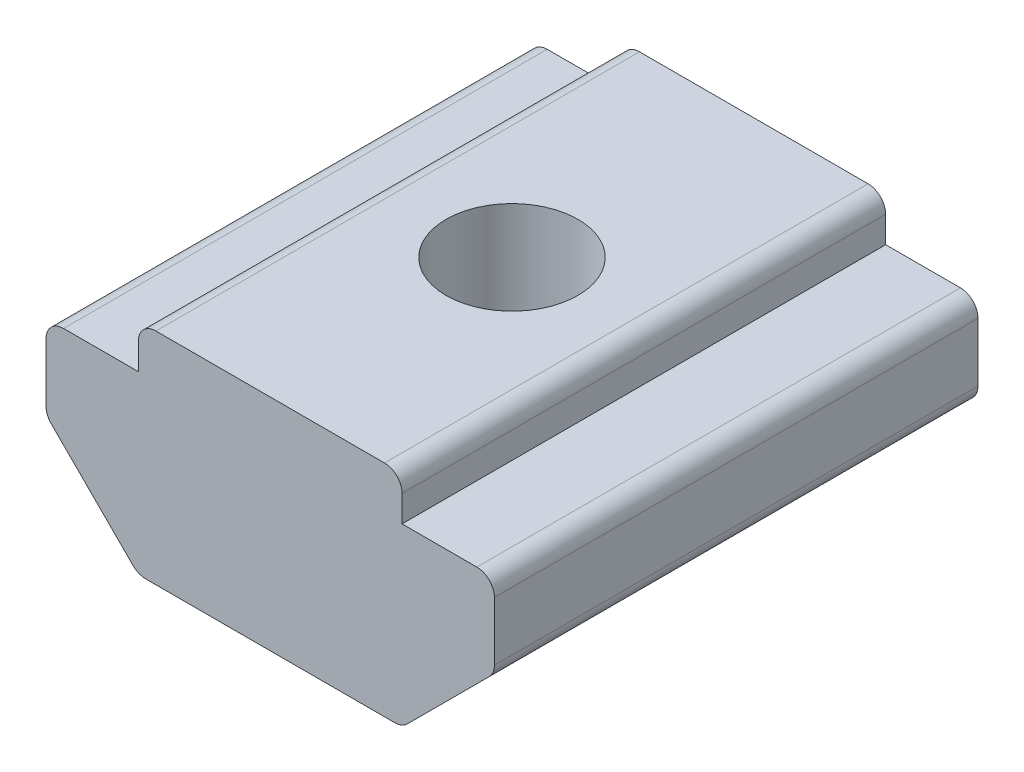
ISO-10303-21;
HEADER;
FILE_DESCRIPTION(('STEP AP214'),'2;1');
FILE_NAME('part.step','',(''),(''),'','','');
FILE_SCHEMA(('AUTOMOTIVE_DESIGN { 1 0 10303 214 1 1 1 1 }'));
ENDSEC;
DATA;
#1=APPLICATION_CONTEXT('core data for automotive mechanical design processes');
#2=APPLICATION_PROTOCOL_DEFINITION('international standard','automotive_design',2000,#1);
#3=PRODUCT_CONTEXT('',#1,'mechanical');
#4=PRODUCT('Part','Part','',(#3));
#5=PRODUCT_RELATED_PRODUCT_CATEGORY('part','',(#4));
#6=PRODUCT_DEFINITION_FORMATION('','',#4);
#7=PRODUCT_DEFINITION_CONTEXT('part definition',#1,'design');
#8=PRODUCT_DEFINITION('design','',#6,#7);
#9=PRODUCT_DEFINITION_SHAPE('','',#8);
#10=(LENGTH_UNIT() NAMED_UNIT(*) SI_UNIT(.MILLI.,.METRE.));
#11=(NAMED_UNIT(*) PLANE_ANGLE_UNIT() SI_UNIT($,.RADIAN.));
#12=(NAMED_UNIT(*) SI_UNIT($,.STERADIAN.) SOLID_ANGLE_UNIT());
#13=UNCERTAINTY_MEASURE_WITH_UNIT(LENGTH_MEASURE(1.E-05),#10,'distance_accuracy_value','');
#14=(GEOMETRIC_REPRESENTATION_CONTEXT(3) GLOBAL_UNCERTAINTY_ASSIGNED_CONTEXT((#13)) GLOBAL_UNIT_ASSIGNED_CONTEXT((#10,
#11,#12)) REPRESENTATION_CONTEXT('',''));
#15=CARTESIAN_POINT('',(0.,0.,0.));
#16=DIRECTION('',(0.,0.,1.));
#17=DIRECTION('',(1.,0.,0.));
#18=AXIS2_PLACEMENT_3D('',#15,#16,#17);
#19=CARTESIAN_POINT('',(-5.1,-1.9,5.5));
#20=DIRECTION('',(1.,0.,0.));
#21=DIRECTION('',(0.,1.,0.));
#22=AXIS2_PLACEMENT_3D('',#19,#20,#21);
#23=PLANE('',#22);
#24=DIRECTION('',(0.,-1.,0.));
#25=VECTOR('',#24,1.);
#26=CARTESIAN_POINT('',(-5.1,-1.9,5.5));
#27=LINE('',#26,#25);
#28=CARTESIAN_POINT('',(-5.1,-0.4,5.5));
#29=VERTEX_POINT('',#28);
#30=CARTESIAN_POINT('',(-5.1,-1.73431457505077,5.5));
#31=VERTEX_POINT('',#30);
#32=EDGE_CURVE('E226',#29,#31,#27,.T.);
#33=ORIENTED_EDGE('',*,*,#32,.F.);
#34=DIRECTION('',(0.,0.,-1.));
#35=VECTOR('',#34,1.);
#36=CARTESIAN_POINT('',(-5.1,-0.4,5.5));
#37=LINE('',#36,#35);
#38=CARTESIAN_POINT('',(-5.1,-0.4,-5.5));
#39=VERTEX_POINT('',#38);
#40=EDGE_CURVE('E269',#29,#39,#37,.T.);
#41=ORIENTED_EDGE('',*,*,#40,.T.);
#42=DIRECTION('',(0.,-1.,0.));
#43=VECTOR('',#42,1.);
#44=CARTESIAN_POINT('',(-5.1,-1.9,-5.5));
#45=LINE('',#44,#43);
#46=CARTESIAN_POINT('',(-5.1,-1.73431457505077,-5.5));
#47=VERTEX_POINT('',#46);
#48=EDGE_CURVE('E200',#39,#47,#45,.T.);
#49=ORIENTED_EDGE('',*,*,#48,.T.);
#50=DIRECTION('',(0.,0.,-1.));
#51=VECTOR('',#50,1.);
#52=CARTESIAN_POINT('',(-5.1,-1.73431457505077,5.5));
#53=LINE('',#52,#51);
#54=EDGE_CURVE('E267',#47,#31,#53,.F.);
#55=ORIENTED_EDGE('',*,*,#54,.T.);
#56=EDGE_LOOP('',(#33,#41,#49,#55));
#57=FACE_BOUND('',#56,.T.);
#58=ADVANCED_FACE('F37',(#57),#23,.F.);
#59=CARTESIAN_POINT('',(-3.,-4.,5.5));
#60=DIRECTION('',(0.707106781186547,0.707106781186548,0.));
#61=DIRECTION('',(-0.707106781186548,0.707106781186547,0.));
#62=AXIS2_PLACEMENT_3D('',#59,#60,#61);
#63=PLANE('',#62);
#64=DIRECTION('',(0.707106781186548,-0.707106781186547,0.));
#65=VECTOR('',#64,1.);
#66=CARTESIAN_POINT('',(-3.,-4.,5.5));
#67=LINE('',#66,#65);
#68=CARTESIAN_POINT('',(-4.98284271247462,-2.01715728752538,5.5));
#69=VERTEX_POINT('',#68);
#70=CARTESIAN_POINT('',(-3.11715728752538,-3.88284271247462,5.5));
#71=VERTEX_POINT('',#70);
#72=EDGE_CURVE('E310',#69,#71,#67,.T.);
#73=ORIENTED_EDGE('',*,*,#72,.F.);
#74=DIRECTION('',(0.,0.,-1.));
#75=VECTOR('',#74,1.);
#76=CARTESIAN_POINT('',(-4.98284271247462,-2.01715728752538,5.5));
#77=LINE('',#76,#75);
#78=CARTESIAN_POINT('',(-4.98284271247462,-2.01715728752538,-5.5));
#79=VERTEX_POINT('',#78);
#80=EDGE_CURVE('E275',#69,#79,#77,.T.);
#81=ORIENTED_EDGE('',*,*,#80,.T.);
#82=DIRECTION('',(0.707106781186548,-0.707106781186547,0.));
#83=VECTOR('',#82,1.);
#84=CARTESIAN_POINT('',(-3.,-4.,-5.5));
#85=LINE('',#84,#83);
#86=CARTESIAN_POINT('',(-3.11715728752538,-3.88284271247462,-5.5));
#87=VERTEX_POINT('',#86);
#88=EDGE_CURVE('E203',#79,#87,#85,.T.);
#89=ORIENTED_EDGE('',*,*,#88,.T.);
#90=DIRECTION('',(0.,0.,-1.));
#91=VECTOR('',#90,1.);
#92=CARTESIAN_POINT('',(-3.11715728752538,-3.88284271247462,5.5));
#93=LINE('',#92,#91);
#94=EDGE_CURVE('E273',#87,#71,#93,.F.);
#95=ORIENTED_EDGE('',*,*,#94,.T.);
#96=EDGE_LOOP('',(#73,#81,#89,#95));
#97=FACE_BOUND('',#96,.T.);
#98=ADVANCED_FACE('F363',(#97),#63,.F.);
#99=CARTESIAN_POINT('',(3.,-4.,5.5));
#100=DIRECTION('',(0.,1.,0.));
#101=DIRECTION('',(0.,0.,1.));
#102=AXIS2_PLACEMENT_3D('',#99,#100,#101);
#103=PLANE('',#102);
#104=CARTESIAN_POINT('',(0.,-4.,0.));
#105=DIRECTION('',(0.,1.,0.));
#106=DIRECTION('',(0.,0.,1.));
#107=AXIS2_PLACEMENT_3D('',#104,#105,#106);
#108=CIRCLE('',#107,1.5);
#109=CARTESIAN_POINT('',(0.,-4.,1.5));
#110=VERTEX_POINT('',#109);
#111=EDGE_CURVE('E204',#110,#110,#108,.T.);
#112=ORIENTED_EDGE('',*,*,#111,.T.);
#113=EDGE_LOOP('',(#112));
#114=FACE_BOUND('',#113,.T.);
#115=DIRECTION('',(1.,0.,0.));
#116=VECTOR('',#115,1.);
#117=CARTESIAN_POINT('',(3.,-4.,5.5));
#118=LINE('',#117,#116);
#119=CARTESIAN_POINT('',(-2.83431457505076,-4.,5.5));
#120=VERTEX_POINT('',#119);
#121=CARTESIAN_POINT('',(2.83431457505076,-4.,5.5));
#122=VERTEX_POINT('',#121);
#123=EDGE_CURVE('E305',#120,#122,#118,.T.);
#124=ORIENTED_EDGE('',*,*,#123,.F.);
#125=DIRECTION('',(0.,0.,-1.));
#126=VECTOR('',#125,1.);
#127=CARTESIAN_POINT('',(-2.83431457505076,-4.,5.5));
#128=LINE('',#127,#126);
#129=CARTESIAN_POINT('',(-2.83431457505076,-4.,-5.5));
#130=VERTEX_POINT('',#129);
#131=EDGE_CURVE('E280',#120,#130,#128,.T.);
#132=ORIENTED_EDGE('',*,*,#131,.T.);
#133=DIRECTION('',(1.,0.,0.));
#134=VECTOR('',#133,1.);
#135=CARTESIAN_POINT('',(3.,-4.,-5.5));
#136=LINE('',#135,#134);
#137=CARTESIAN_POINT('',(2.83431457505076,-4.,-5.5));
#138=VERTEX_POINT('',#137);
#139=EDGE_CURVE('E207',#130,#138,#136,.T.);
#140=ORIENTED_EDGE('',*,*,#139,.T.);
#141=DIRECTION('',(0.,0.,-1.));
#142=VECTOR('',#141,1.);
#143=CARTESIAN_POINT('',(2.83431457505076,-4.,5.5));
#144=LINE('',#143,#142);
#145=EDGE_CURVE('E278',#138,#122,#144,.F.);
#146=ORIENTED_EDGE('',*,*,#145,.T.);
#147=EDGE_LOOP('',(#124,#132,#140,#146));
#148=FACE_BOUND('',#147,.T.);
#149=ADVANCED_FACE('F321',(#114,#148),#103,.F.);
#150=CARTESIAN_POINT('',(5.1,-1.9,5.5));
#151=DIRECTION('',(-0.707106781186547,0.707106781186548,0.));
#152=DIRECTION('',(-0.707106781186548,-0.707106781186547,0.));
#153=AXIS2_PLACEMENT_3D('',#150,#151,#152);
#154=PLANE('',#153);
#155=DIRECTION('',(0.707106781186548,0.707106781186547,0.));
#156=VECTOR('',#155,1.);
#157=CARTESIAN_POINT('',(5.1,-1.9,5.5));
#158=LINE('',#157,#156);
#159=CARTESIAN_POINT('',(3.11715728752538,-3.88284271247462,5.5));
#160=VERTEX_POINT('',#159);
#161=CARTESIAN_POINT('',(4.98284271247462,-2.01715728752538,5.5));
#162=VERTEX_POINT('',#161);
#163=EDGE_CURVE('E304',#160,#162,#158,.T.);
#164=ORIENTED_EDGE('',*,*,#163,.F.);
#165=DIRECTION('',(0.,0.,-1.));
#166=VECTOR('',#165,1.);
#167=CARTESIAN_POINT('',(3.11715728752538,-3.88284271247462,5.5));
#168=LINE('',#167,#166);
#169=CARTESIAN_POINT('',(3.11715728752538,-3.88284271247462,-5.5));
#170=VERTEX_POINT('',#169);
#171=EDGE_CURVE('E285',#160,#170,#168,.T.);
#172=ORIENTED_EDGE('',*,*,#171,.T.);
#173=DIRECTION('',(0.707106781186548,0.707106781186547,0.));
#174=VECTOR('',#173,1.);
#175=CARTESIAN_POINT('',(5.1,-1.9,-5.5));
#176=LINE('',#175,#174);
#177=CARTESIAN_POINT('',(4.98284271247462,-2.01715728752538,-5.5));
#178=VERTEX_POINT('',#177);
#179=EDGE_CURVE('E210',#170,#178,#176,.T.);
#180=ORIENTED_EDGE('',*,*,#179,.T.);
#181=DIRECTION('',(0.,0.,-1.));
#182=VECTOR('',#181,1.);
#183=CARTESIAN_POINT('',(4.98284271247462,-2.01715728752538,5.5));
#184=LINE('',#183,#182);
#185=EDGE_CURVE('E283',#178,#162,#184,.F.);
#186=ORIENTED_EDGE('',*,*,#185,.T.);
#187=EDGE_LOOP('',(#164,#172,#180,#186));
#188=FACE_BOUND('',#187,.T.);
#189=ADVANCED_FACE('F378',(#188),#154,.F.);
#190=CARTESIAN_POINT('',(5.1,0.,5.5));
#191=DIRECTION('',(-1.,0.,0.));
#192=DIRECTION('',(0.,-1.,0.));
#193=AXIS2_PLACEMENT_3D('',#190,#191,#192);
#194=PLANE('',#193);
#195=DIRECTION('',(0.,1.,0.));
#196=VECTOR('',#195,1.);
#197=CARTESIAN_POINT('',(5.1,0.,5.5));
#198=LINE('',#197,#196);
#199=CARTESIAN_POINT('',(5.1,-1.73431457505076,5.5));
#200=VERTEX_POINT('',#199);
#201=CARTESIAN_POINT('',(5.1,-0.4,5.5));
#202=VERTEX_POINT('',#201);
#203=EDGE_CURVE('E175',#200,#202,#198,.T.);
#204=ORIENTED_EDGE('',*,*,#203,.F.);
#205=DIRECTION('',(0.,0.,-1.));
#206=VECTOR('',#205,1.);
#207=CARTESIAN_POINT('',(5.1,-1.73431457505076,5.5));
#208=LINE('',#207,#206);
#209=CARTESIAN_POINT('',(5.1,-1.73431457505076,-5.5));
#210=VERTEX_POINT('',#209);
#211=EDGE_CURVE('E45',#200,#210,#208,.T.);
#212=ORIENTED_EDGE('',*,*,#211,.T.);
#213=DIRECTION('',(0.,1.,0.));
#214=VECTOR('',#213,1.);
#215=CARTESIAN_POINT('',(5.1,0.,-5.5));
#216=LINE('',#215,#214);
#217=CARTESIAN_POINT('',(5.1,-0.4,-5.5));
#218=VERTEX_POINT('',#217);
#219=EDGE_CURVE('E213',#210,#218,#216,.T.);
#220=ORIENTED_EDGE('',*,*,#219,.T.);
#221=DIRECTION('',(0.,0.,-1.));
#222=VECTOR('',#221,1.);
#223=CARTESIAN_POINT('',(5.1,-0.4,5.5));
#224=LINE('',#223,#222);
#225=EDGE_CURVE('E288',#218,#202,#224,.F.);
#226=ORIENTED_EDGE('',*,*,#225,.T.);
#227=EDGE_LOOP('',(#204,#212,#220,#226));
#228=FACE_BOUND('',#227,.T.);
#229=ADVANCED_FACE('F294',(#228),#194,.F.);
#230=CARTESIAN_POINT('',(3.,0.,5.5));
#231=DIRECTION('',(0.,-1.,0.));
#232=DIRECTION('',(0.,0.,-1.));
#233=AXIS2_PLACEMENT_3D('',#230,#231,#232);
#234=PLANE('',#233);
#235=DIRECTION('',(-1.,0.,0.));
#236=VECTOR('',#235,1.);
#237=CARTESIAN_POINT('',(3.,0.,5.5));
#238=LINE('',#237,#236);
#239=CARTESIAN_POINT('',(4.7,0.,5.5));
#240=VERTEX_POINT('',#239);
#241=CARTESIAN_POINT('',(3.,0.,5.5));
#242=VERTEX_POINT('',#241);
#243=EDGE_CURVE('E164',#240,#242,#238,.T.);
#244=ORIENTED_EDGE('',*,*,#243,.F.);
#245=DIRECTION('',(0.,0.,-1.));
#246=VECTOR('',#245,1.);
#247=CARTESIAN_POINT('',(4.7,0.,5.5));
#248=LINE('',#247,#246);
#249=CARTESIAN_POINT('',(4.7,0.,-5.5));
#250=VERTEX_POINT('',#249);
#251=EDGE_CURVE('E11',#240,#250,#248,.T.);
#252=ORIENTED_EDGE('',*,*,#251,.T.);
#253=DIRECTION('',(-1.,0.,0.));
#254=VECTOR('',#253,1.);
#255=CARTESIAN_POINT('',(3.,0.,-5.5));
#256=LINE('',#255,#254);
#257=CARTESIAN_POINT('',(3.,0.,-5.5));
#258=VERTEX_POINT('',#257);
#259=EDGE_CURVE('E181',#250,#258,#256,.T.);
#260=ORIENTED_EDGE('',*,*,#259,.T.);
#261=DIRECTION('',(0.,0.,-1.));
#262=VECTOR('',#261,1.);
#263=CARTESIAN_POINT('',(3.,0.,5.5));
#264=LINE('',#263,#262);
#265=EDGE_CURVE('E178',#242,#258,#264,.T.);
#266=ORIENTED_EDGE('',*,*,#265,.F.);
#267=EDGE_LOOP('',(#244,#252,#260,#266));
#268=FACE_BOUND('',#267,.T.);
#269=ADVANCED_FACE('F179',(#268),#234,.F.);
#270=CARTESIAN_POINT('',(3.,0.999999999999999,5.5));
#271=DIRECTION('',(-1.,0.,0.));
#272=DIRECTION('',(0.,0.,1.));
#273=AXIS2_PLACEMENT_3D('',#270,#271,#272);
#274=PLANE('',#273);
#275=DIRECTION('',(0.,1.,0.));
#276=VECTOR('',#275,1.);
#277=CARTESIAN_POINT('',(3.,0.999999999999999,-5.5));
#278=LINE('',#277,#276);
#279=CARTESIAN_POINT('',(3.,0.599999999999999,-5.5));
#280=VERTEX_POINT('',#279);
#281=EDGE_CURVE('E217',#258,#280,#278,.T.);
#282=ORIENTED_EDGE('',*,*,#281,.T.);
#283=DIRECTION('',(0.,0.,-1.));
#284=VECTOR('',#283,1.);
#285=CARTESIAN_POINT('',(3.,0.599999999999999,5.5));
#286=LINE('',#285,#284);
#287=CARTESIAN_POINT('',(3.,0.599999999999999,5.5));
#288=VERTEX_POINT('',#287);
#289=EDGE_CURVE('E190',#280,#288,#286,.F.);
#290=ORIENTED_EDGE('',*,*,#289,.T.);
#291=DIRECTION('',(0.,1.,0.));
#292=VECTOR('',#291,1.);
#293=CARTESIAN_POINT('',(3.,0.999999999999999,5.5));
#294=LINE('',#293,#292);
#295=EDGE_CURVE('E168',#242,#288,#294,.T.);
#296=ORIENTED_EDGE('',*,*,#295,.F.);
#297=ORIENTED_EDGE('',*,*,#265,.T.);
#298=EDGE_LOOP('',(#282,#290,#296,#297));
#299=FACE_BOUND('',#298,.T.);
#300=ADVANCED_FACE('F188',(#299),#274,.F.);
#301=CARTESIAN_POINT('',(-3.,0.999999999999999,5.5));
#302=DIRECTION('',(0.,-1.,0.));
#303=DIRECTION('',(0.,0.,-1.));
#304=AXIS2_PLACEMENT_3D('',#301,#302,#303);
#305=PLANE('',#304);
#306=CARTESIAN_POINT('',(0.,0.999999999999999,0.));
#307=DIRECTION('',(0.,1.,0.));
#308=DIRECTION('',(0.,0.,1.));
#309=AXIS2_PLACEMENT_3D('',#306,#307,#308);
#310=CIRCLE('',#309,1.5);
#311=CARTESIAN_POINT('',(0.,0.999999999999999,1.5));
#312=VERTEX_POINT('',#311);
#313=EDGE_CURVE('E315',#312,#312,#310,.T.);
#314=ORIENTED_EDGE('',*,*,#313,.F.);
#315=EDGE_LOOP('',(#314));
#316=FACE_BOUND('',#315,.T.);
#317=DIRECTION('',(-1.,0.,0.));
#318=VECTOR('',#317,1.);
#319=CARTESIAN_POINT('',(-3.,0.999999999999999,5.5));
#320=LINE('',#319,#318);
#321=CARTESIAN_POINT('',(2.6,0.999999999999999,5.5));
#322=VERTEX_POINT('',#321);
#323=CARTESIAN_POINT('',(-2.6,0.999999999999999,5.5));
#324=VERTEX_POINT('',#323);
#325=EDGE_CURVE('E191',#322,#324,#320,.T.);
#326=ORIENTED_EDGE('',*,*,#325,.F.);
#327=DIRECTION('',(0.,0.,-1.));
#328=VECTOR('',#327,1.);
#329=CARTESIAN_POINT('',(2.6,0.999999999999999,5.5));
#330=LINE('',#329,#328);
#331=CARTESIAN_POINT('',(2.6,0.999999999999999,-5.5));
#332=VERTEX_POINT('',#331);
#333=EDGE_CURVE('E230',#322,#332,#330,.T.);
#334=ORIENTED_EDGE('',*,*,#333,.T.);
#335=DIRECTION('',(-1.,0.,0.));
#336=VECTOR('',#335,1.);
#337=CARTESIAN_POINT('',(-3.,0.999999999999999,-5.5));
#338=LINE('',#337,#336);
#339=CARTESIAN_POINT('',(-2.6,0.999999999999999,-5.5));
#340=VERTEX_POINT('',#339);
#341=EDGE_CURVE('E219',#332,#340,#338,.T.);
#342=ORIENTED_EDGE('',*,*,#341,.T.);
#343=DIRECTION('',(0.,0.,-1.));
#344=VECTOR('',#343,1.);
#345=CARTESIAN_POINT('',(-2.6,0.999999999999999,5.5));
#346=LINE('',#345,#344);
#347=EDGE_CURVE('E185',#340,#324,#346,.F.);
#348=ORIENTED_EDGE('',*,*,#347,.T.);
#349=EDGE_LOOP('',(#326,#334,#342,#348));
#350=FACE_BOUND('',#349,.T.);
#351=ADVANCED_FACE('F331',(#316,#350),#305,.F.);
#352=CARTESIAN_POINT('',(-3.,0.,5.5));
#353=DIRECTION('',(1.,0.,0.));
#354=DIRECTION('',(0.,0.,-1.));
#355=AXIS2_PLACEMENT_3D('',#352,#353,#354);
#356=PLANE('',#355);
#357=DIRECTION('',(0.,-1.,0.));
#358=VECTOR('',#357,1.);
#359=CARTESIAN_POINT('',(-3.,0.,5.5));
#360=LINE('',#359,#358);
#361=CARTESIAN_POINT('',(-3.,0.599999999999999,5.5));
#362=VERTEX_POINT('',#361);
#363=CARTESIAN_POINT('',(-3.,0.,5.5));
#364=VERTEX_POINT('',#363);
#365=EDGE_CURVE('E193',#362,#364,#360,.T.);
#366=ORIENTED_EDGE('',*,*,#365,.F.);
#367=DIRECTION('',(0.,0.,-1.));
#368=VECTOR('',#367,1.);
#369=CARTESIAN_POINT('',(-3.,0.599999999999999,5.5));
#370=LINE('',#369,#368);
#371=CARTESIAN_POINT('',(-3.,0.599999999999999,-5.5));
#372=VERTEX_POINT('',#371);
#373=EDGE_CURVE('E264',#362,#372,#370,.T.);
#374=ORIENTED_EDGE('',*,*,#373,.T.);
#375=DIRECTION('',(0.,-1.,0.));
#376=VECTOR('',#375,1.);
#377=CARTESIAN_POINT('',(-3.,0.,-5.5));
#378=LINE('',#377,#376);
#379=CARTESIAN_POINT('',(-3.,0.,-5.5));
#380=VERTEX_POINT('',#379);
#381=EDGE_CURVE('E222',#372,#380,#378,.T.);
#382=ORIENTED_EDGE('',*,*,#381,.T.);
#383=DIRECTION('',(0.,0.,-1.));
#384=VECTOR('',#383,1.);
#385=CARTESIAN_POINT('',(-3.,0.,5.5));
#386=LINE('',#385,#384);
#387=EDGE_CURVE('E186',#364,#380,#386,.T.);
#388=ORIENTED_EDGE('',*,*,#387,.F.);
#389=EDGE_LOOP('',(#366,#374,#382,#388));
#390=FACE_BOUND('',#389,.T.);
#391=ADVANCED_FACE('F334',(#390),#356,.F.);
#392=CARTESIAN_POINT('',(-5.1,0.,5.5));
#393=DIRECTION('',(0.,-1.,0.));
#394=DIRECTION('',(0.,0.,-1.));
#395=AXIS2_PLACEMENT_3D('',#392,#393,#394);
#396=PLANE('',#395);
#397=DIRECTION('',(-1.,0.,0.));
#398=VECTOR('',#397,1.);
#399=CARTESIAN_POINT('',(-5.1,0.,-5.5));
#400=LINE('',#399,#398);
#401=CARTESIAN_POINT('',(-4.7,0.,-5.5));
#402=VERTEX_POINT('',#401);
#403=EDGE_CURVE('E224',#380,#402,#400,.T.);
#404=ORIENTED_EDGE('',*,*,#403,.T.);
#405=DIRECTION('',(0.,0.,-1.));
#406=VECTOR('',#405,1.);
#407=CARTESIAN_POINT('',(-4.7,0.,5.5));
#408=LINE('',#407,#406);
#409=CARTESIAN_POINT('',(-4.7,0.,5.5));
#410=VERTEX_POINT('',#409);
#411=EDGE_CURVE('E52',#402,#410,#408,.F.);
#412=ORIENTED_EDGE('',*,*,#411,.T.);
#413=DIRECTION('',(-1.,0.,0.));
#414=VECTOR('',#413,1.);
#415=CARTESIAN_POINT('',(-5.1,0.,5.5));
#416=LINE('',#415,#414);
#417=EDGE_CURVE('E198',#364,#410,#416,.T.);
#418=ORIENTED_EDGE('',*,*,#417,.F.);
#419=ORIENTED_EDGE('',*,*,#387,.T.);
#420=EDGE_LOOP('',(#404,#412,#418,#419));
#421=FACE_BOUND('',#420,.T.);
#422=ADVANCED_FACE('F348',(#421),#396,.F.);
#423=CARTESIAN_POINT('',(0.,0.,5.5));
#424=DIRECTION('',(0.,0.,-1.));
#425=DIRECTION('',(-1.,0.,0.));
#426=AXIS2_PLACEMENT_3D('',#423,#424,#425);
#427=PLANE('',#426);
#428=ORIENTED_EDGE('',*,*,#295,.T.);
#429=CARTESIAN_POINT('',(2.6,0.599999999999999,5.5));
#430=DIRECTION('',(0.,0.,-1.));
#431=DIRECTION('',(-1.,0.,0.));
#432=AXIS2_PLACEMENT_3D('',#429,#430,#431);
#433=CIRCLE('',#432,0.4);
#434=EDGE_CURVE('E262',#288,#322,#433,.F.);
#435=ORIENTED_EDGE('',*,*,#434,.T.);
#436=ORIENTED_EDGE('',*,*,#325,.T.);
#437=CARTESIAN_POINT('',(-2.6,0.599999999999999,5.5));
#438=DIRECTION('',(0.,0.,-1.));
#439=DIRECTION('',(-1.,0.,0.));
#440=AXIS2_PLACEMENT_3D('',#437,#438,#439);
#441=CIRCLE('',#440,0.4);
#442=EDGE_CURVE('E60',#324,#362,#441,.F.);
#443=ORIENTED_EDGE('',*,*,#442,.T.);
#444=ORIENTED_EDGE('',*,*,#365,.T.);
#445=ORIENTED_EDGE('',*,*,#417,.T.);
#446=CARTESIAN_POINT('',(-4.7,-0.4,5.5));
#447=DIRECTION('',(0.,0.,-1.));
#448=DIRECTION('',(-1.,0.,0.));
#449=AXIS2_PLACEMENT_3D('',#446,#447,#448);
#450=CIRCLE('',#449,0.4);
#451=EDGE_CURVE('E259',#410,#29,#450,.F.);
#452=ORIENTED_EDGE('',*,*,#451,.T.);
#453=ORIENTED_EDGE('',*,*,#32,.T.);
#454=CARTESIAN_POINT('',(-4.7,-1.73431457505077,5.5));
#455=DIRECTION('',(0.,0.,-1.));
#456=DIRECTION('',(-1.,0.,0.));
#457=AXIS2_PLACEMENT_3D('',#454,#455,#456);
#458=CIRCLE('',#457,0.4);
#459=EDGE_CURVE('E257',#31,#69,#458,.F.);
#460=ORIENTED_EDGE('',*,*,#459,.T.);
#461=ORIENTED_EDGE('',*,*,#72,.T.);
#462=CARTESIAN_POINT('',(-2.83431457505076,-3.6,5.5));
#463=DIRECTION('',(0.,0.,-1.));
#464=DIRECTION('',(-1.,0.,0.));
#465=AXIS2_PLACEMENT_3D('',#462,#463,#464);
#466=CIRCLE('',#465,0.4);
#467=EDGE_CURVE('E255',#71,#120,#466,.F.);
#468=ORIENTED_EDGE('',*,*,#467,.T.);
#469=ORIENTED_EDGE('',*,*,#123,.T.);
#470=CARTESIAN_POINT('',(2.83431457505076,-3.6,5.5));
#471=DIRECTION('',(0.,0.,-1.));
#472=DIRECTION('',(-1.,0.,0.));
#473=AXIS2_PLACEMENT_3D('',#470,#471,#472);
#474=CIRCLE('',#473,0.4);
#475=EDGE_CURVE('E253',#122,#160,#474,.F.);
#476=ORIENTED_EDGE('',*,*,#475,.T.);
#477=ORIENTED_EDGE('',*,*,#163,.T.);
#478=CARTESIAN_POINT('',(4.7,-1.73431457505076,5.5));
#479=DIRECTION('',(0.,0.,-1.));
#480=DIRECTION('',(-1.,0.,0.));
#481=AXIS2_PLACEMENT_3D('',#478,#479,#480);
#482=CIRCLE('',#481,0.4);
#483=EDGE_CURVE('E251',#162,#200,#482,.F.);
#484=ORIENTED_EDGE('',*,*,#483,.T.);
#485=ORIENTED_EDGE('',*,*,#203,.T.);
#486=CARTESIAN_POINT('',(4.7,-0.4,5.5));
#487=DIRECTION('',(0.,0.,-1.));
#488=DIRECTION('',(-1.,0.,0.));
#489=AXIS2_PLACEMENT_3D('',#486,#487,#488);
#490=CIRCLE('',#489,0.4);
#491=EDGE_CURVE('E172',#202,#240,#490,.F.);
#492=ORIENTED_EDGE('',*,*,#491,.T.);
#493=ORIENTED_EDGE('',*,*,#243,.T.);
#494=EDGE_LOOP('',(#428,#435,#436,#443,#444,#445,#452,#453,#460,#461,#468,#469,#476,#477,#484,
#485,#492,#493));
#495=FACE_BOUND('',#494,.T.);
#496=ADVANCED_FACE('F166',(#495),#427,.F.);
#497=CARTESIAN_POINT('',(0.,0.,-5.5));
#498=DIRECTION('',(0.,0.,-1.));
#499=DIRECTION('',(-1.,0.,0.));
#500=AXIS2_PLACEMENT_3D('',#497,#498,#499);
#501=PLANE('',#500);
#502=ORIENTED_EDGE('',*,*,#341,.F.);
#503=CARTESIAN_POINT('',(2.6,0.599999999999999,-5.5));
#504=DIRECTION('',(0.,0.,-1.));
#505=DIRECTION('',(-1.,0.,0.));
#506=AXIS2_PLACEMENT_3D('',#503,#504,#505);
#507=CIRCLE('',#506,0.4);
#508=EDGE_CURVE('E247',#332,#280,#507,.T.);
#509=ORIENTED_EDGE('',*,*,#508,.T.);
#510=ORIENTED_EDGE('',*,*,#281,.F.);
#511=ORIENTED_EDGE('',*,*,#259,.F.);
#512=CARTESIAN_POINT('',(4.7,-0.4,-5.5));
#513=DIRECTION('',(0.,0.,-1.));
#514=DIRECTION('',(-1.,0.,0.));
#515=AXIS2_PLACEMENT_3D('',#512,#513,#514);
#516=CIRCLE('',#515,0.4);
#517=EDGE_CURVE('E233',#250,#218,#516,.T.);
#518=ORIENTED_EDGE('',*,*,#517,.T.);
#519=ORIENTED_EDGE('',*,*,#219,.F.);
#520=CARTESIAN_POINT('',(4.7,-1.73431457505076,-5.5));
#521=DIRECTION('',(0.,0.,-1.));
#522=DIRECTION('',(-1.,0.,0.));
#523=AXIS2_PLACEMENT_3D('',#520,#521,#522);
#524=CIRCLE('',#523,0.4);
#525=EDGE_CURVE('E235',#210,#178,#524,.T.);
#526=ORIENTED_EDGE('',*,*,#525,.T.);
#527=ORIENTED_EDGE('',*,*,#179,.F.);
#528=CARTESIAN_POINT('',(2.83431457505076,-3.6,-5.5));
#529=DIRECTION('',(0.,0.,-1.));
#530=DIRECTION('',(-1.,0.,0.));
#531=AXIS2_PLACEMENT_3D('',#528,#529,#530);
#532=CIRCLE('',#531,0.4);
#533=EDGE_CURVE('E237',#170,#138,#532,.T.);
#534=ORIENTED_EDGE('',*,*,#533,.T.);
#535=ORIENTED_EDGE('',*,*,#139,.F.);
#536=CARTESIAN_POINT('',(-2.83431457505076,-3.6,-5.5));
#537=DIRECTION('',(0.,0.,-1.));
#538=DIRECTION('',(-1.,0.,0.));
#539=AXIS2_PLACEMENT_3D('',#536,#537,#538);
#540=CIRCLE('',#539,0.4);
#541=EDGE_CURVE('E239',#130,#87,#540,.T.);
#542=ORIENTED_EDGE('',*,*,#541,.T.);
#543=ORIENTED_EDGE('',*,*,#88,.F.);
#544=CARTESIAN_POINT('',(-4.7,-1.73431457505077,-5.5));
#545=DIRECTION('',(0.,0.,-1.));
#546=DIRECTION('',(-1.,0.,0.));
#547=AXIS2_PLACEMENT_3D('',#544,#545,#546);
#548=CIRCLE('',#547,0.4);
#549=EDGE_CURVE('E241',#79,#47,#548,.T.);
#550=ORIENTED_EDGE('',*,*,#549,.T.);
#551=ORIENTED_EDGE('',*,*,#48,.F.);
#552=CARTESIAN_POINT('',(-4.7,-0.4,-5.5));
#553=DIRECTION('',(0.,0.,-1.));
#554=DIRECTION('',(-1.,0.,0.));
#555=AXIS2_PLACEMENT_3D('',#552,#553,#554);
#556=CIRCLE('',#555,0.4);
#557=EDGE_CURVE('E243',#39,#402,#556,.T.);
#558=ORIENTED_EDGE('',*,*,#557,.T.);
#559=ORIENTED_EDGE('',*,*,#403,.F.);
#560=ORIENTED_EDGE('',*,*,#381,.F.);
#561=CARTESIAN_POINT('',(-2.6,0.599999999999999,-5.5));
#562=DIRECTION('',(0.,0.,-1.));
#563=DIRECTION('',(-1.,0.,0.));
#564=AXIS2_PLACEMENT_3D('',#561,#562,#563);
#565=CIRCLE('',#564,0.4);
#566=EDGE_CURVE('E245',#372,#340,#565,.T.);
#567=ORIENTED_EDGE('',*,*,#566,.T.);
#568=EDGE_LOOP('',(#502,#509,#510,#511,#518,#519,#526,#527,#534,#535,#542,#543,#550,#551,#558,
#559,#560,#567));
#569=FACE_BOUND('',#568,.T.);
#570=ADVANCED_FACE('F300',(#569),#501,.T.);
#571=CARTESIAN_POINT('',(0.,-4.,0.));
#572=DIRECTION('',(0.,1.,0.));
#573=DIRECTION('',(0.,0.,1.));
#574=AXIS2_PLACEMENT_3D('',#571,#572,#573);
#575=CYLINDRICAL_SURFACE('',#574,1.5);
#576=ORIENTED_EDGE('',*,*,#111,.F.);
#577=EDGE_LOOP('',(#576));
#578=FACE_BOUND('',#577,.T.);
#579=ORIENTED_EDGE('',*,*,#313,.T.);
#580=EDGE_LOOP('',(#579));
#581=FACE_BOUND('',#580,.T.);
#582=ADVANCED_FACE('F324',(#578,#581),#575,.F.);
#583=CARTESIAN_POINT('',(2.6,0.599999999999999,5.5));
#584=DIRECTION('',(0.,0.,-1.));
#585=DIRECTION('',(-1.,0.,0.));
#586=AXIS2_PLACEMENT_3D('',#583,#584,#585);
#587=CYLINDRICAL_SURFACE('',#586,0.4);
#588=ORIENTED_EDGE('',*,*,#434,.F.);
#589=ORIENTED_EDGE('',*,*,#289,.F.);
#590=ORIENTED_EDGE('',*,*,#508,.F.);
#591=ORIENTED_EDGE('',*,*,#333,.F.);
#592=EDGE_LOOP('',(#588,#589,#590,#591));
#593=FACE_BOUND('',#592,.T.);
#594=ADVANCED_FACE('F327',(#593),#587,.T.);
#595=CARTESIAN_POINT('',(-2.6,0.599999999999999,5.5));
#596=DIRECTION('',(0.,0.,-1.));
#597=DIRECTION('',(-1.,0.,0.));
#598=AXIS2_PLACEMENT_3D('',#595,#596,#597);
#599=CYLINDRICAL_SURFACE('',#598,0.4);
#600=ORIENTED_EDGE('',*,*,#442,.F.);
#601=ORIENTED_EDGE('',*,*,#347,.F.);
#602=ORIENTED_EDGE('',*,*,#566,.F.);
#603=ORIENTED_EDGE('',*,*,#373,.F.);
#604=EDGE_LOOP('',(#600,#601,#602,#603));
#605=FACE_BOUND('',#604,.T.);
#606=ADVANCED_FACE('F342',(#605),#599,.T.);
#607=CARTESIAN_POINT('',(-4.7,-0.4,5.5));
#608=DIRECTION('',(0.,0.,-1.));
#609=DIRECTION('',(-1.,0.,0.));
#610=AXIS2_PLACEMENT_3D('',#607,#608,#609);
#611=CYLINDRICAL_SURFACE('',#610,0.4);
#612=ORIENTED_EDGE('',*,*,#451,.F.);
#613=ORIENTED_EDGE('',*,*,#411,.F.);
#614=ORIENTED_EDGE('',*,*,#557,.F.);
#615=ORIENTED_EDGE('',*,*,#40,.F.);
#616=EDGE_LOOP('',(#612,#613,#614,#615));
#617=FACE_BOUND('',#616,.T.);
#618=ADVANCED_FACE('F351',(#617),#611,.T.);
#619=CARTESIAN_POINT('',(-4.7,-1.73431457505077,5.5));
#620=DIRECTION('',(0.,0.,-1.));
#621=DIRECTION('',(-1.,0.,0.));
#622=AXIS2_PLACEMENT_3D('',#619,#620,#621);
#623=CYLINDRICAL_SURFACE('',#622,0.4);
#624=ORIENTED_EDGE('',*,*,#459,.F.);
#625=ORIENTED_EDGE('',*,*,#54,.F.);
#626=ORIENTED_EDGE('',*,*,#549,.F.);
#627=ORIENTED_EDGE('',*,*,#80,.F.);
#628=EDGE_LOOP('',(#624,#625,#626,#627));
#629=FACE_BOUND('',#628,.T.);
#630=ADVANCED_FACE('F358',(#629),#623,.T.);
#631=CARTESIAN_POINT('',(-2.83431457505076,-3.6,5.5));
#632=DIRECTION('',(0.,0.,-1.));
#633=DIRECTION('',(-1.,0.,0.));
#634=AXIS2_PLACEMENT_3D('',#631,#632,#633);
#635=CYLINDRICAL_SURFACE('',#634,0.4);
#636=ORIENTED_EDGE('',*,*,#467,.F.);
#637=ORIENTED_EDGE('',*,*,#94,.F.);
#638=ORIENTED_EDGE('',*,*,#541,.F.);
#639=ORIENTED_EDGE('',*,*,#131,.F.);
#640=EDGE_LOOP('',(#636,#637,#638,#639));
#641=FACE_BOUND('',#640,.T.);
#642=ADVANCED_FACE('F367',(#641),#635,.T.);
#643=CARTESIAN_POINT('',(2.83431457505076,-3.6,5.5));
#644=DIRECTION('',(0.,0.,-1.));
#645=DIRECTION('',(-1.,0.,0.));
#646=AXIS2_PLACEMENT_3D('',#643,#644,#645);
#647=CYLINDRICAL_SURFACE('',#646,0.4);
#648=ORIENTED_EDGE('',*,*,#475,.F.);
#649=ORIENTED_EDGE('',*,*,#145,.F.);
#650=ORIENTED_EDGE('',*,*,#533,.F.);
#651=ORIENTED_EDGE('',*,*,#171,.F.);
#652=EDGE_LOOP('',(#648,#649,#650,#651));
#653=FACE_BOUND('',#652,.T.);
#654=ADVANCED_FACE('F374',(#653),#647,.T.);
#655=CARTESIAN_POINT('',(4.7,-1.73431457505076,5.5));
#656=DIRECTION('',(0.,0.,-1.));
#657=DIRECTION('',(-1.,0.,0.));
#658=AXIS2_PLACEMENT_3D('',#655,#656,#657);
#659=CYLINDRICAL_SURFACE('',#658,0.4);
#660=ORIENTED_EDGE('',*,*,#483,.F.);
#661=ORIENTED_EDGE('',*,*,#185,.F.);
#662=ORIENTED_EDGE('',*,*,#525,.F.);
#663=ORIENTED_EDGE('',*,*,#211,.F.);
#664=EDGE_LOOP('',(#660,#661,#662,#663));
#665=FACE_BOUND('',#664,.T.);
#666=ADVANCED_FACE('F380',(#665),#659,.T.);
#667=CARTESIAN_POINT('',(4.7,-0.4,5.5));
#668=DIRECTION('',(0.,0.,-1.));
#669=DIRECTION('',(-1.,0.,0.));
#670=AXIS2_PLACEMENT_3D('',#667,#668,#669);
#671=CYLINDRICAL_SURFACE('',#670,0.4);
#672=ORIENTED_EDGE('',*,*,#491,.F.);
#673=ORIENTED_EDGE('',*,*,#225,.F.);
#674=ORIENTED_EDGE('',*,*,#517,.F.);
#675=ORIENTED_EDGE('',*,*,#251,.F.);
#676=EDGE_LOOP('',(#672,#673,#674,#675));
#677=FACE_BOUND('',#676,.T.);
#678=ADVANCED_FACE('F39',(#677),#671,.T.);
#679=CLOSED_SHELL('',(#58,#98,#149,#189,#229,#269,#300,#351,#391,#422,#496,#570,#582,#594,#606,
#618,#630,#642,#654,#666,#678));
#680=MANIFOLD_SOLID_BREP('B2',#679);
#681=ADVANCED_BREP_SHAPE_REPRESENTATION('',(#18,#680),#14);
#682=SHAPE_DEFINITION_REPRESENTATION(#9,#681);
ENDSEC;
END-ISO-10303-21;
